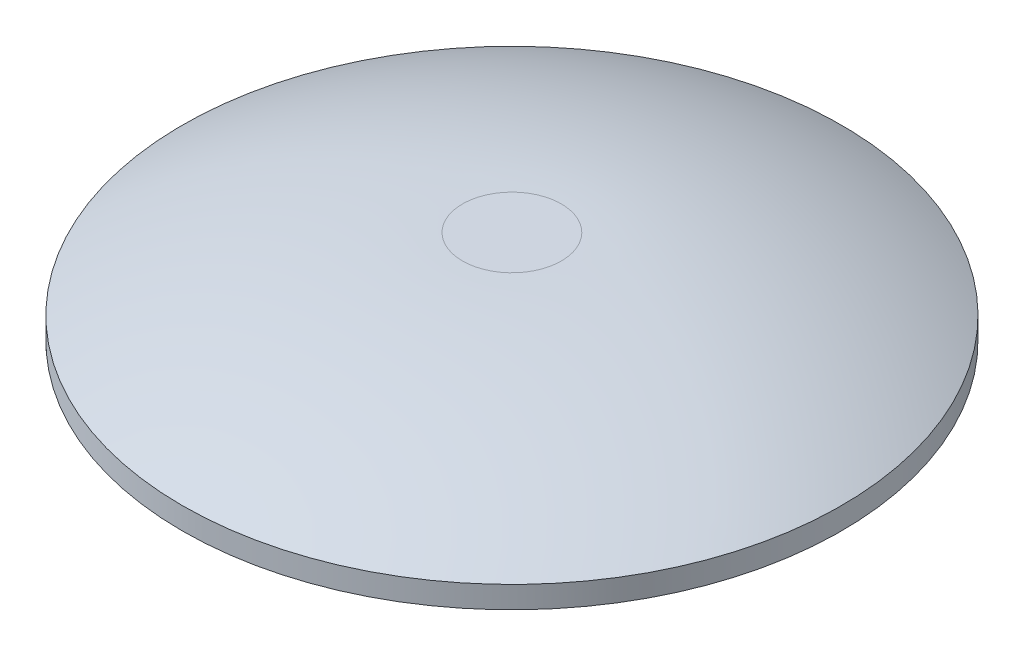
ISO-10303-21;
HEADER;
FILE_DESCRIPTION(('STEP AP214'),'2;1');
FILE_NAME('part.step','',(''),(''),'','','');
FILE_SCHEMA(('AUTOMOTIVE_DESIGN { 1 0 10303 214 1 1 1 1 }'));
ENDSEC;
DATA;
#1=APPLICATION_CONTEXT('core data for automotive mechanical design processes');
#2=APPLICATION_PROTOCOL_DEFINITION('international standard','automotive_design',2000,#1);
#3=PRODUCT_CONTEXT('',#1,'mechanical');
#4=PRODUCT('Part','Part','',(#3));
#5=PRODUCT_RELATED_PRODUCT_CATEGORY('part','',(#4));
#6=PRODUCT_DEFINITION_FORMATION('','',#4);
#7=PRODUCT_DEFINITION_CONTEXT('part definition',#1,'design');
#8=PRODUCT_DEFINITION('design','',#6,#7);
#9=PRODUCT_DEFINITION_SHAPE('','',#8);
#10=(LENGTH_UNIT() NAMED_UNIT(*) SI_UNIT(.MILLI.,.METRE.));
#11=(NAMED_UNIT(*) PLANE_ANGLE_UNIT() SI_UNIT($,.RADIAN.));
#12=(NAMED_UNIT(*) SI_UNIT($,.STERADIAN.) SOLID_ANGLE_UNIT());
#13=UNCERTAINTY_MEASURE_WITH_UNIT(LENGTH_MEASURE(1.E-05),#10,'distance_accuracy_value','');
#14=(GEOMETRIC_REPRESENTATION_CONTEXT(3) GLOBAL_UNCERTAINTY_ASSIGNED_CONTEXT((#13)) GLOBAL_UNIT_ASSIGNED_CONTEXT((#10,
#11,#12)) REPRESENTATION_CONTEXT('',''));
#15=CARTESIAN_POINT('',(0.,0.,0.));
#16=DIRECTION('',(0.,0.,1.));
#17=DIRECTION('',(1.,0.,0.));
#18=AXIS2_PLACEMENT_3D('',#15,#16,#17);
#19=CARTESIAN_POINT('',(0.,-530.163893918988,0.));
#20=DIRECTION('',(0.,1.,0.));
#21=DIRECTION('',(0.,0.,1.));
#22=AXIS2_PLACEMENT_3D('',#19,#20,#21);
#23=DEGENERATE_TOROIDAL_SURFACE('',#22,45.,530.163893918988,.T.);
#24=CARTESIAN_POINT('',(0.,0.,0.));
#25=DIRECTION('',(0.,1.,0.));
#26=DIRECTION('',(0.,0.,1.));
#27=AXIS2_PLACEMENT_3D('',#24,#25,#26);
#28=CIRCLE('',#27,45.);
#29=CARTESIAN_POINT('',(0.,0.,45.));
#30=VERTEX_POINT('',#29);
#31=EDGE_CURVE('E57',#30,#30,#28,.T.);
#32=ORIENTED_EDGE('',*,*,#31,.F.);
#33=EDGE_LOOP('',(#32));
#34=FACE_BOUND('',#33,.T.);
#35=CARTESIAN_POINT('',(0.,-65.3534439338956,0.));
#36=DIRECTION('',(0.,1.,0.));
#37=DIRECTION('',(0.,0.,1.));
#38=AXIS2_PLACEMENT_3D('',#35,#36,#37);
#39=CIRCLE('',#38,300.);
#40=CARTESIAN_POINT('',(0.,-65.3534439338956,300.));
#41=VERTEX_POINT('',#40);
#42=EDGE_CURVE('E10',#41,#41,#39,.T.);
#43=ORIENTED_EDGE('',*,*,#42,.T.);
#44=EDGE_LOOP('',(#43));
#45=FACE_BOUND('',#44,.T.);
#46=ADVANCED_FACE('F40',(#34,#45),#23,.T.);
#47=CARTESIAN_POINT('',(0.,0.,0.));
#48=DIRECTION('',(0.,1.,0.));
#49=DIRECTION('',(0.,0.,1.));
#50=AXIS2_PLACEMENT_3D('',#47,#48,#49);
#51=CYLINDRICAL_SURFACE('',#50,300.);
#52=ORIENTED_EDGE('',*,*,#42,.F.);
#53=EDGE_LOOP('',(#52));
#54=FACE_BOUND('',#53,.T.);
#55=CARTESIAN_POINT('',(0.,-85.3534439338957,0.));
#56=DIRECTION('',(0.,1.,0.));
#57=DIRECTION('',(0.,0.,1.));
#58=AXIS2_PLACEMENT_3D('',#55,#56,#57);
#59=CIRCLE('',#58,300.);
#60=CARTESIAN_POINT('',(0.,-85.3534439338957,300.));
#61=VERTEX_POINT('',#60);
#62=EDGE_CURVE('E47',#61,#61,#59,.T.);
#63=ORIENTED_EDGE('',*,*,#62,.T.);
#64=EDGE_LOOP('',(#63));
#65=FACE_BOUND('',#64,.T.);
#66=ADVANCED_FACE('F67',(#54,#65),#51,.T.);
#67=CARTESIAN_POINT('',(0.,379.457006051197,0.));
#68=DIRECTION('',(0.,1.,0.));
#69=DIRECTION('',(0.,0.,1.));
#70=AXIS2_PLACEMENT_3D('',#67,#68,#69);
#71=DEGENERATE_TOROIDAL_SURFACE('',#70,45.,530.163893918988,.T.);
#72=ORIENTED_EDGE('',*,*,#62,.F.);
#73=EDGE_LOOP('',(#72));
#74=FACE_BOUND('',#73,.T.);
#75=CARTESIAN_POINT('',(0.,-150.706887867791,0.));
#76=DIRECTION('',(0.,1.,0.));
#77=DIRECTION('',(0.,0.,1.));
#78=AXIS2_PLACEMENT_3D('',#75,#76,#77);
#79=CIRCLE('',#78,45.);
#80=CARTESIAN_POINT('',(0.,-150.706887867791,45.));
#81=VERTEX_POINT('',#80);
#82=EDGE_CURVE('E52',#81,#81,#79,.T.);
#83=ORIENTED_EDGE('',*,*,#82,.T.);
#84=EDGE_LOOP('',(#83));
#85=FACE_BOUND('',#84,.T.);
#86=ADVANCED_FACE('F71',(#74,#85),#71,.T.);
#87=CARTESIAN_POINT('',(0.,-150.706887867791,0.));
#88=DIRECTION('',(0.,1.,0.));
#89=DIRECTION('',(0.,0.,1.));
#90=AXIS2_PLACEMENT_3D('',#87,#88,#89);
#91=PLANE('',#90);
#92=ORIENTED_EDGE('',*,*,#82,.F.);
#93=EDGE_LOOP('',(#92));
#94=FACE_BOUND('',#93,.T.);
#95=ADVANCED_FACE('F76',(#94),#91,.F.);
#96=CARTESIAN_POINT('',(45.,0.,0.));
#97=DIRECTION('',(0.,-1.,0.));
#98=DIRECTION('',(0.,0.,-1.));
#99=AXIS2_PLACEMENT_3D('',#96,#97,#98);
#100=PLANE('',#99);
#101=ORIENTED_EDGE('',*,*,#31,.T.);
#102=EDGE_LOOP('',(#101));
#103=FACE_BOUND('',#102,.T.);
#104=ADVANCED_FACE('F64',(#103),#100,.F.);
#105=CLOSED_SHELL('',(#46,#66,#86,#95,#104));
#106=MANIFOLD_SOLID_BREP('B2',#105);
#107=ADVANCED_BREP_SHAPE_REPRESENTATION('',(#18,#106),#14);
#108=SHAPE_DEFINITION_REPRESENTATION(#9,#107);
ENDSEC;
END-ISO-10303-21;
